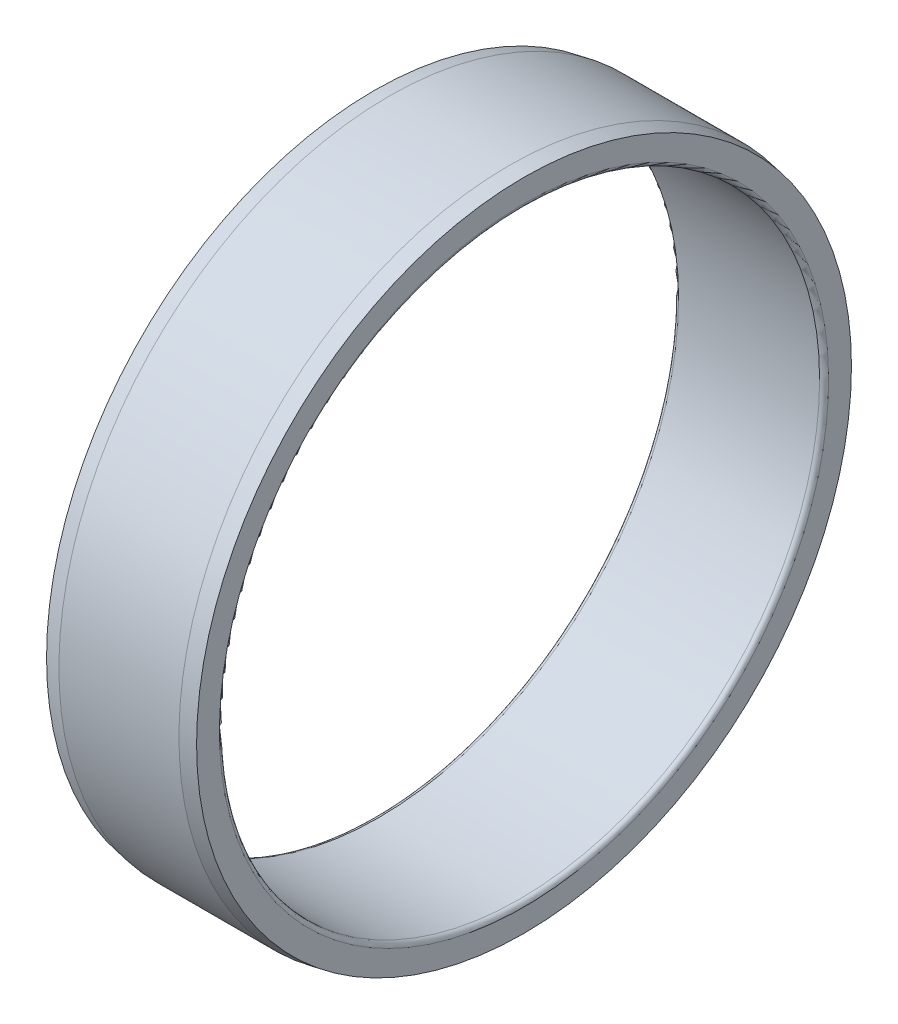
ISO-10303-21;
HEADER;
FILE_DESCRIPTION(('STEP AP214'),'2;1');
FILE_NAME('part.step','',(''),(''),'','','');
FILE_SCHEMA(('AUTOMOTIVE_DESIGN { 1 0 10303 214 1 1 1 1 }'));
ENDSEC;
DATA;
#1=APPLICATION_CONTEXT('core data for automotive mechanical design processes');
#2=APPLICATION_PROTOCOL_DEFINITION('international standard','automotive_design',2000,#1);
#3=PRODUCT_CONTEXT('',#1,'mechanical');
#4=PRODUCT('Part','Part','',(#3));
#5=PRODUCT_RELATED_PRODUCT_CATEGORY('part','',(#4));
#6=PRODUCT_DEFINITION_FORMATION('','',#4);
#7=PRODUCT_DEFINITION_CONTEXT('part definition',#1,'design');
#8=PRODUCT_DEFINITION('design','',#6,#7);
#9=PRODUCT_DEFINITION_SHAPE('','',#8);
#10=(LENGTH_UNIT() NAMED_UNIT(*) SI_UNIT(.MILLI.,.METRE.));
#11=(NAMED_UNIT(*) PLANE_ANGLE_UNIT() SI_UNIT($,.RADIAN.));
#12=(NAMED_UNIT(*) SI_UNIT($,.STERADIAN.) SOLID_ANGLE_UNIT());
#13=UNCERTAINTY_MEASURE_WITH_UNIT(LENGTH_MEASURE(1.E-05),#10,'distance_accuracy_value','');
#14=(GEOMETRIC_REPRESENTATION_CONTEXT(3) GLOBAL_UNCERTAINTY_ASSIGNED_CONTEXT((#13)) GLOBAL_UNIT_ASSIGNED_CONTEXT((#10,
#11,#12)) REPRESENTATION_CONTEXT('',''));
#15=CARTESIAN_POINT('',(0.,0.,0.));
#16=DIRECTION('',(0.,0.,1.));
#17=DIRECTION('',(1.,0.,0.));
#18=AXIS2_PLACEMENT_3D('',#15,#16,#17);
#19=CARTESIAN_POINT('',(0.,105.309182548229,0.));
#20=DIRECTION('',(-1.,0.,0.));
#21=DIRECTION('',(0.,-1.,0.));
#22=AXIS2_PLACEMENT_3D('',#19,#20,#21);
#23=PLANE('',#22);
#24=CARTESIAN_POINT('',(0.,0.,0.));
#25=DIRECTION('',(1.,0.,0.));
#26=DIRECTION('',(0.,1.,0.));
#27=AXIS2_PLACEMENT_3D('',#24,#25,#26);
#28=CIRCLE('',#27,101.5);
#29=CARTESIAN_POINT('',(0.,101.5,0.));
#30=VERTEX_POINT('',#29);
#31=EDGE_CURVE('E11',#30,#30,#28,.T.);
#32=ORIENTED_EDGE('',*,*,#31,.T.);
#33=EDGE_LOOP('',(#32));
#34=FACE_BOUND('',#33,.T.);
#35=CARTESIAN_POINT('',(0.,0.,0.));
#36=DIRECTION('',(1.,0.,0.));
#37=DIRECTION('',(0.,1.,0.));
#38=AXIS2_PLACEMENT_3D('',#35,#36,#37);
#39=CIRCLE('',#38,109.118365096458);
#40=CARTESIAN_POINT('',(0.,109.118365096458,0.));
#41=VERTEX_POINT('',#40);
#42=EDGE_CURVE('E47',#41,#41,#39,.T.);
#43=ORIENTED_EDGE('',*,*,#42,.F.);
#44=EDGE_LOOP('',(#43));
#45=FACE_BOUND('',#44,.T.);
#46=ADVANCED_FACE('F17',(#34,#45),#23,.T.);
#47=CARTESIAN_POINT('',(1.5,0.,0.));
#48=DIRECTION('',(1.,0.,0.));
#49=DIRECTION('',(0.,0.,-1.));
#50=AXIS2_PLACEMENT_3D('',#47,#48,#49);
#51=TOROIDAL_SURFACE('',#50,101.5,1.5);
#52=CARTESIAN_POINT('',(1.5,0.,0.));
#53=DIRECTION('',(1.,0.,0.));
#54=DIRECTION('',(0.,1.,0.));
#55=AXIS2_PLACEMENT_3D('',#52,#53,#54);
#56=CIRCLE('',#55,100.);
#57=CARTESIAN_POINT('',(1.5,100.,0.));
#58=VERTEX_POINT('',#57);
#59=EDGE_CURVE('E26',#58,#58,#56,.T.);
#60=ORIENTED_EDGE('',*,*,#59,.T.);
#61=EDGE_LOOP('',(#60));
#62=FACE_BOUND('',#61,.T.);
#63=ORIENTED_EDGE('',*,*,#31,.F.);
#64=EDGE_LOOP('',(#63));
#65=FACE_BOUND('',#64,.T.);
#66=ADVANCED_FACE('F88',(#62,#65),#51,.T.);
#67=CARTESIAN_POINT('',(25.,0.,0.));
#68=DIRECTION('',(-1.,0.,0.));
#69=DIRECTION('',(0.,1.,0.));
#70=AXIS2_PLACEMENT_3D('',#67,#68,#69);
#71=CYLINDRICAL_SURFACE('',#70,100.);
#72=CARTESIAN_POINT('',(48.5,0.,0.));
#73=DIRECTION('',(1.,0.,0.));
#74=DIRECTION('',(0.,1.,0.));
#75=AXIS2_PLACEMENT_3D('',#72,#73,#74);
#76=CIRCLE('',#75,100.);
#77=CARTESIAN_POINT('',(48.5,100.,0.));
#78=VERTEX_POINT('',#77);
#79=EDGE_CURVE('E67',#78,#78,#76,.T.);
#80=ORIENTED_EDGE('',*,*,#79,.T.);
#81=EDGE_LOOP('',(#80));
#82=FACE_BOUND('',#81,.T.);
#83=ORIENTED_EDGE('',*,*,#59,.F.);
#84=EDGE_LOOP('',(#83));
#85=FACE_BOUND('',#84,.T.);
#86=ADVANCED_FACE('F19',(#82,#85),#71,.F.);
#87=CARTESIAN_POINT('',(48.5,0.,0.));
#88=DIRECTION('',(1.,0.,0.));
#89=DIRECTION('',(0.,0.,-1.));
#90=AXIS2_PLACEMENT_3D('',#87,#88,#89);
#91=TOROIDAL_SURFACE('',#90,101.5,1.5);
#92=CARTESIAN_POINT('',(50.,0.,0.));
#93=DIRECTION('',(1.,0.,0.));
#94=DIRECTION('',(0.,1.,0.));
#95=AXIS2_PLACEMENT_3D('',#92,#93,#94);
#96=CIRCLE('',#95,101.5);
#97=CARTESIAN_POINT('',(50.,101.5,0.));
#98=VERTEX_POINT('',#97);
#99=EDGE_CURVE('E59',#98,#98,#96,.T.);
#100=ORIENTED_EDGE('',*,*,#99,.T.);
#101=EDGE_LOOP('',(#100));
#102=FACE_BOUND('',#101,.T.);
#103=ORIENTED_EDGE('',*,*,#79,.F.);
#104=EDGE_LOOP('',(#103));
#105=FACE_BOUND('',#104,.T.);
#106=ADVANCED_FACE('F79',(#102,#105),#91,.T.);
#107=CARTESIAN_POINT('',(50.,105.309182548229,0.));
#108=DIRECTION('',(1.,0.,0.));
#109=DIRECTION('',(0.,1.,0.));
#110=AXIS2_PLACEMENT_3D('',#107,#108,#109);
#111=PLANE('',#110);
#112=CARTESIAN_POINT('',(50.,0.,0.));
#113=DIRECTION('',(1.,0.,0.));
#114=DIRECTION('',(0.,1.,0.));
#115=AXIS2_PLACEMENT_3D('',#112,#113,#114);
#116=CIRCLE('',#115,109.118365096458);
#117=CARTESIAN_POINT('',(50.,109.118365096458,0.));
#118=VERTEX_POINT('',#117);
#119=EDGE_CURVE('E21',#118,#118,#116,.T.);
#120=ORIENTED_EDGE('',*,*,#119,.T.);
#121=EDGE_LOOP('',(#120));
#122=FACE_BOUND('',#121,.T.);
#123=ORIENTED_EDGE('',*,*,#99,.F.);
#124=EDGE_LOOP('',(#123));
#125=FACE_BOUND('',#124,.T.);
#126=ADVANCED_FACE('F63',(#122,#125),#111,.T.);
#127=CARTESIAN_POINT('',(47.5,0.,0.));
#128=DIRECTION('',(-1.,0.,0.));
#129=DIRECTION('',(0.,1.,0.));
#130=AXIS2_PLACEMENT_3D('',#127,#128,#129);
#131=CONICAL_SURFACE('',#130,109.559182548229,0.17453292519944);
#132=CARTESIAN_POINT('',(45.,0.,0.));
#133=DIRECTION('',(1.,0.,0.));
#134=DIRECTION('',(0.,1.,0.));
#135=AXIS2_PLACEMENT_3D('',#132,#133,#134);
#136=CIRCLE('',#135,110.);
#137=CARTESIAN_POINT('',(45.,110.,0.));
#138=VERTEX_POINT('',#137);
#139=EDGE_CURVE('E66',#138,#138,#136,.T.);
#140=ORIENTED_EDGE('',*,*,#139,.T.);
#141=EDGE_LOOP('',(#140));
#142=FACE_BOUND('',#141,.T.);
#143=ORIENTED_EDGE('',*,*,#119,.F.);
#144=EDGE_LOOP('',(#143));
#145=FACE_BOUND('',#144,.T.);
#146=ADVANCED_FACE('F86',(#142,#145),#131,.T.);
#147=CARTESIAN_POINT('',(25.,0.,0.));
#148=DIRECTION('',(-1.,0.,0.));
#149=DIRECTION('',(0.,1.,0.));
#150=AXIS2_PLACEMENT_3D('',#147,#148,#149);
#151=CYLINDRICAL_SURFACE('',#150,110.);
#152=CARTESIAN_POINT('',(5.,0.,0.));
#153=DIRECTION('',(1.,0.,0.));
#154=DIRECTION('',(0.,1.,0.));
#155=AXIS2_PLACEMENT_3D('',#152,#153,#154);
#156=CIRCLE('',#155,110.);
#157=CARTESIAN_POINT('',(5.,110.,0.));
#158=VERTEX_POINT('',#157);
#159=EDGE_CURVE('E54',#158,#158,#156,.T.);
#160=ORIENTED_EDGE('',*,*,#159,.T.);
#161=EDGE_LOOP('',(#160));
#162=FACE_BOUND('',#161,.T.);
#163=ORIENTED_EDGE('',*,*,#139,.F.);
#164=EDGE_LOOP('',(#163));
#165=FACE_BOUND('',#164,.T.);
#166=ADVANCED_FACE('F99',(#162,#165),#151,.T.);
#167=CARTESIAN_POINT('',(2.5,0.,0.));
#168=DIRECTION('',(1.,0.,0.));
#169=DIRECTION('',(0.,1.,0.));
#170=AXIS2_PLACEMENT_3D('',#167,#168,#169);
#171=CONICAL_SURFACE('',#170,109.559182548229,0.174532925199438);
#172=ORIENTED_EDGE('',*,*,#42,.T.);
#173=EDGE_LOOP('',(#172));
#174=FACE_BOUND('',#173,.T.);
#175=ORIENTED_EDGE('',*,*,#159,.F.);
#176=EDGE_LOOP('',(#175));
#177=FACE_BOUND('',#176,.T.);
#178=ADVANCED_FACE('F102',(#174,#177),#171,.T.);
#179=CLOSED_SHELL('',(#46,#66,#86,#106,#126,#146,#166,#178));
#180=MANIFOLD_SOLID_BREP('B1',#179);
#181=ADVANCED_BREP_SHAPE_REPRESENTATION('',(#18,#180),#14);
#182=SHAPE_DEFINITION_REPRESENTATION(#9,#181);
ENDSEC;
END-ISO-10303-21;
